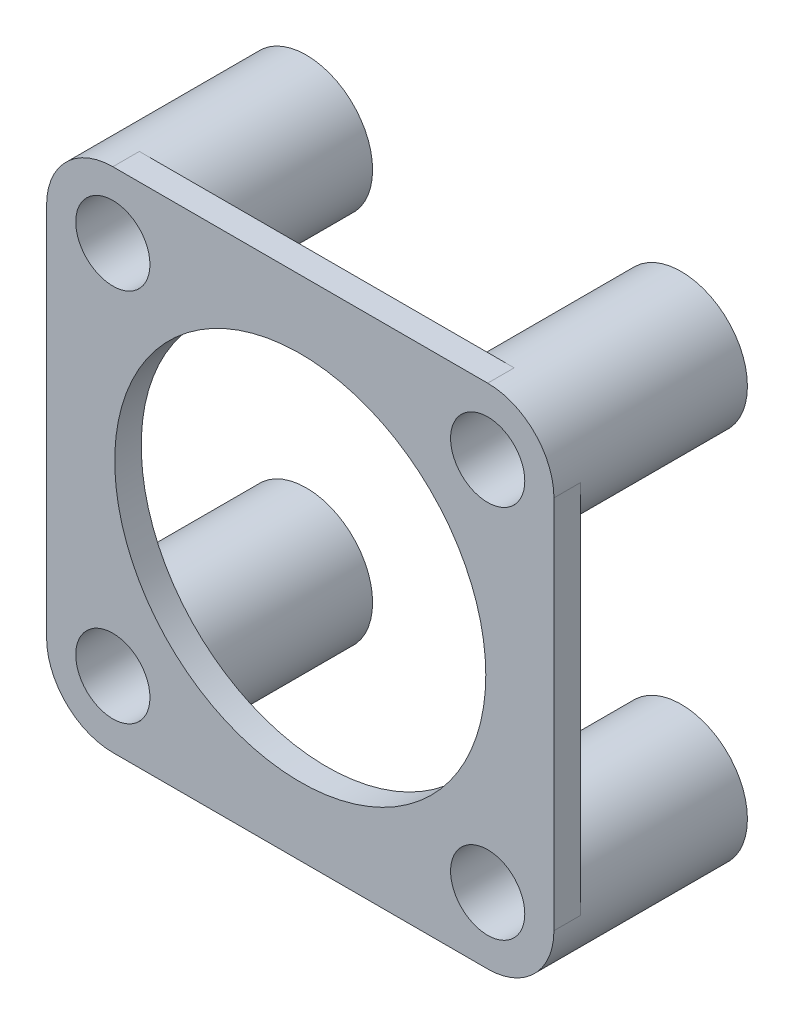
ISO-10303-21;
HEADER;
FILE_DESCRIPTION(('STEP AP214'),'2;1');
FILE_NAME('part.step','',(''),(''),'','','');
FILE_SCHEMA(('AUTOMOTIVE_DESIGN { 1 0 10303 214 1 1 1 1 }'));
ENDSEC;
DATA;
#1=APPLICATION_CONTEXT('core data for automotive mechanical design processes');
#2=APPLICATION_PROTOCOL_DEFINITION('international standard','automotive_design',2000,#1);
#3=PRODUCT_CONTEXT('',#1,'mechanical');
#4=PRODUCT('Part','Part','',(#3));
#5=PRODUCT_RELATED_PRODUCT_CATEGORY('part','',(#4));
#6=PRODUCT_DEFINITION_FORMATION('','',#4);
#7=PRODUCT_DEFINITION_CONTEXT('part definition',#1,'design');
#8=PRODUCT_DEFINITION('design','',#6,#7);
#9=PRODUCT_DEFINITION_SHAPE('','',#8);
#10=(LENGTH_UNIT() NAMED_UNIT(*) SI_UNIT(.MILLI.,.METRE.));
#11=(NAMED_UNIT(*) PLANE_ANGLE_UNIT() SI_UNIT($,.RADIAN.));
#12=(NAMED_UNIT(*) SI_UNIT($,.STERADIAN.) SOLID_ANGLE_UNIT());
#13=UNCERTAINTY_MEASURE_WITH_UNIT(LENGTH_MEASURE(1.E-05),#10,'distance_accuracy_value','');
#14=(GEOMETRIC_REPRESENTATION_CONTEXT(3) GLOBAL_UNCERTAINTY_ASSIGNED_CONTEXT((#13)) GLOBAL_UNIT_ASSIGNED_CONTEXT((#10,
#11,#12)) REPRESENTATION_CONTEXT('',''));
#15=CARTESIAN_POINT('',(0.,0.,0.));
#16=DIRECTION('',(0.,0.,1.));
#17=DIRECTION('',(1.,0.,0.));
#18=AXIS2_PLACEMENT_3D('',#15,#16,#17);
#19=CARTESIAN_POINT('',(-7.07106781186548,7.07106781186548,6.3));
#20=DIRECTION('',(0.,0.,1.));
#21=DIRECTION('',(1.,0.,0.));
#22=AXIS2_PLACEMENT_3D('',#19,#20,#21);
#23=PLANE('',#22);
#24=CARTESIAN_POINT('',(0.,0.,6.3));
#25=DIRECTION('',(0.,0.,1.));
#26=DIRECTION('',(1.,0.,0.));
#27=AXIS2_PLACEMENT_3D('',#24,#25,#26);
#28=CIRCLE('',#27,7.);
#29=CARTESIAN_POINT('',(7.,0.,6.3));
#30=VERTEX_POINT('',#29);
#31=EDGE_CURVE('E270',#30,#30,#28,.T.);
#32=ORIENTED_EDGE('',*,*,#31,.T.);
#33=EDGE_LOOP('',(#32));
#34=FACE_BOUND('',#33,.T.);
#35=CARTESIAN_POINT('',(-7.07106781186548,-7.07106781186547,6.3));
#36=DIRECTION('',(0.,0.,1.));
#37=DIRECTION('',(1.,0.,0.));
#38=AXIS2_PLACEMENT_3D('',#35,#36,#37);
#39=CIRCLE('',#38,2.5);
#40=CARTESIAN_POINT('',(-7.07106781186548,-9.57106781186547,6.3));
#41=VERTEX_POINT('',#40);
#42=CARTESIAN_POINT('',(-9.57106781186548,-7.07106781186547,6.3));
#43=VERTEX_POINT('',#42);
#44=EDGE_CURVE('E252',#41,#43,#39,.T.);
#45=ORIENTED_EDGE('',*,*,#44,.T.);
#46=DIRECTION('',(0.,-1.,0.));
#47=VECTOR('',#46,1.);
#48=CARTESIAN_POINT('',(-9.57106781186548,7.07106781186548,6.3));
#49=LINE('',#48,#47);
#50=CARTESIAN_POINT('',(-9.57106781186548,7.07106781186548,6.3));
#51=VERTEX_POINT('',#50);
#52=EDGE_CURVE('E138',#51,#43,#49,.T.);
#53=ORIENTED_EDGE('',*,*,#52,.F.);
#54=CARTESIAN_POINT('',(-7.07106781186548,7.07106781186548,6.3));
#55=DIRECTION('',(0.,0.,1.));
#56=DIRECTION('',(1.,0.,0.));
#57=AXIS2_PLACEMENT_3D('',#54,#55,#56);
#58=CIRCLE('',#57,2.5);
#59=CARTESIAN_POINT('',(-7.07106781186548,9.57106781186548,6.3));
#60=VERTEX_POINT('',#59);
#61=EDGE_CURVE('E11',#51,#60,#58,.T.);
#62=ORIENTED_EDGE('',*,*,#61,.T.);
#63=DIRECTION('',(-1.,0.,0.));
#64=VECTOR('',#63,1.);
#65=CARTESIAN_POINT('',(7.07106781186548,9.57106781186548,6.3));
#66=LINE('',#65,#64);
#67=CARTESIAN_POINT('',(7.07106781186548,9.57106781186548,6.3));
#68=VERTEX_POINT('',#67);
#69=EDGE_CURVE('E146',#68,#60,#66,.T.);
#70=ORIENTED_EDGE('',*,*,#69,.F.);
#71=CARTESIAN_POINT('',(7.07106781186548,7.07106781186548,6.3));
#72=DIRECTION('',(0.,0.,1.));
#73=DIRECTION('',(1.,0.,0.));
#74=AXIS2_PLACEMENT_3D('',#71,#72,#73);
#75=CIRCLE('',#74,2.5);
#76=CARTESIAN_POINT('',(9.57106781186548,7.07106781186548,6.3));
#77=VERTEX_POINT('',#76);
#78=EDGE_CURVE('E261',#68,#77,#75,.T.);
#79=ORIENTED_EDGE('',*,*,#78,.T.);
#80=DIRECTION('',(0.,1.,0.));
#81=VECTOR('',#80,1.);
#82=CARTESIAN_POINT('',(9.57106781186548,-7.07106781186547,6.3));
#83=LINE('',#82,#81);
#84=CARTESIAN_POINT('',(9.57106781186548,-7.07106781186547,6.3));
#85=VERTEX_POINT('',#84);
#86=EDGE_CURVE('E125',#85,#77,#83,.T.);
#87=ORIENTED_EDGE('',*,*,#86,.F.);
#88=CARTESIAN_POINT('',(7.07106781186548,-7.07106781186547,6.3));
#89=DIRECTION('',(0.,0.,1.));
#90=DIRECTION('',(1.,0.,0.));
#91=AXIS2_PLACEMENT_3D('',#88,#89,#90);
#92=CIRCLE('',#91,2.5);
#93=CARTESIAN_POINT('',(7.07106781186548,-9.57106781186547,6.3));
#94=VERTEX_POINT('',#93);
#95=EDGE_CURVE('E247',#85,#94,#92,.T.);
#96=ORIENTED_EDGE('',*,*,#95,.T.);
#97=DIRECTION('',(1.,0.,0.));
#98=VECTOR('',#97,1.);
#99=CARTESIAN_POINT('',(-7.07106781186548,-9.57106781186547,6.3));
#100=LINE('',#99,#98);
#101=EDGE_CURVE('E141',#41,#94,#100,.T.);
#102=ORIENTED_EDGE('',*,*,#101,.F.);
#103=EDGE_LOOP('',(#45,#53,#62,#70,#79,#87,#96,#102));
#104=FACE_BOUND('',#103,.T.);
#105=ADVANCED_FACE('F43',(#34,#104),#23,.F.);
#106=CARTESIAN_POINT('',(-7.07106781186548,7.07106781186548,0.));
#107=DIRECTION('',(0.,0.,1.));
#108=DIRECTION('',(1.,0.,0.));
#109=AXIS2_PLACEMENT_3D('',#106,#107,#108);
#110=PLANE('',#109);
#111=CARTESIAN_POINT('',(-7.07106781186548,7.07106781186548,0.));
#112=DIRECTION('',(0.,0.,1.));
#113=DIRECTION('',(1.,0.,0.));
#114=AXIS2_PLACEMENT_3D('',#111,#112,#113);
#115=CIRCLE('',#114,2.5);
#116=CARTESIAN_POINT('',(-4.57106781186547,7.07106781186548,0.));
#117=VERTEX_POINT('',#116);
#118=EDGE_CURVE('E47',#117,#117,#115,.T.);
#119=ORIENTED_EDGE('',*,*,#118,.F.);
#120=EDGE_LOOP('',(#119));
#121=FACE_BOUND('',#120,.T.);
#122=CARTESIAN_POINT('',(-7.07106781186548,7.07106781186548,0.));
#123=DIRECTION('',(0.,0.,1.));
#124=DIRECTION('',(1.,0.,0.));
#125=AXIS2_PLACEMENT_3D('',#122,#123,#124);
#126=CIRCLE('',#125,1.4);
#127=CARTESIAN_POINT('',(-5.67106781186548,7.07106781186548,0.));
#128=VERTEX_POINT('',#127);
#129=EDGE_CURVE('E163',#128,#128,#126,.T.);
#130=ORIENTED_EDGE('',*,*,#129,.T.);
#131=EDGE_LOOP('',(#130));
#132=FACE_BOUND('',#131,.T.);
#133=ADVANCED_FACE('F171',(#121,#132),#110,.F.);
#134=CARTESIAN_POINT('',(-7.07106781186548,7.07106781186548,6.3));
#135=DIRECTION('',(0.,0.,-1.));
#136=DIRECTION('',(-1.,0.,0.));
#137=AXIS2_PLACEMENT_3D('',#134,#135,#136);
#138=CYLINDRICAL_SURFACE('',#137,2.5);
#139=ORIENTED_EDGE('',*,*,#61,.F.);
#140=DIRECTION('',(0.,0.,-1.));
#141=VECTOR('',#140,1.);
#142=CARTESIAN_POINT('',(-9.57106781186548,7.07106781186548,7.3));
#143=LINE('',#142,#141);
#144=CARTESIAN_POINT('',(-9.57106781186548,7.07106781186548,7.3));
#145=VERTEX_POINT('',#144);
#146=EDGE_CURVE('E161',#145,#51,#143,.T.);
#147=ORIENTED_EDGE('',*,*,#146,.F.);
#148=CARTESIAN_POINT('',(-7.07106781186548,7.07106781186548,7.3));
#149=DIRECTION('',(0.,0.,1.));
#150=DIRECTION('',(1.,0.,0.));
#151=AXIS2_PLACEMENT_3D('',#148,#149,#150);
#152=CIRCLE('',#151,2.5);
#153=CARTESIAN_POINT('',(-7.07106781186548,9.57106781186548,7.3));
#154=VERTEX_POINT('',#153);
#155=EDGE_CURVE('E148',#154,#145,#152,.T.);
#156=ORIENTED_EDGE('',*,*,#155,.F.);
#157=DIRECTION('',(0.,0.,-1.));
#158=VECTOR('',#157,1.);
#159=CARTESIAN_POINT('',(-7.07106781186548,9.57106781186548,7.3));
#160=LINE('',#159,#158);
#161=EDGE_CURVE('E134',#154,#60,#160,.T.);
#162=ORIENTED_EDGE('',*,*,#161,.T.);
#163=EDGE_LOOP('',(#139,#147,#156,#162));
#164=FACE_BOUND('',#163,.T.);
#165=ORIENTED_EDGE('',*,*,#118,.T.);
#166=EDGE_LOOP('',(#165));
#167=FACE_BOUND('',#166,.T.);
#168=ADVANCED_FACE('F45',(#164,#167),#138,.T.);
#169=CARTESIAN_POINT('',(-7.07106781186548,7.07106781186548,6.3));
#170=DIRECTION('',(0.,0.,-1.));
#171=DIRECTION('',(-1.,0.,0.));
#172=AXIS2_PLACEMENT_3D('',#169,#170,#171);
#173=CYLINDRICAL_SURFACE('',#172,1.4);
#174=ORIENTED_EDGE('',*,*,#129,.F.);
#175=EDGE_LOOP('',(#174));
#176=FACE_BOUND('',#175,.T.);
#177=CARTESIAN_POINT('',(-7.07106781186548,7.07106781186548,7.3));
#178=DIRECTION('',(0.,0.,1.));
#179=DIRECTION('',(1.,0.,0.));
#180=AXIS2_PLACEMENT_3D('',#177,#178,#179);
#181=CIRCLE('',#180,1.4);
#182=CARTESIAN_POINT('',(-5.67106781186548,7.07106781186548,7.3));
#183=VERTEX_POINT('',#182);
#184=EDGE_CURVE('E274',#183,#183,#181,.T.);
#185=ORIENTED_EDGE('',*,*,#184,.T.);
#186=EDGE_LOOP('',(#185));
#187=FACE_BOUND('',#186,.T.);
#188=ADVANCED_FACE('F177',(#176,#187),#173,.F.);
#189=CARTESIAN_POINT('',(-7.07106781186548,7.07106781186548,7.3));
#190=DIRECTION('',(0.,0.,1.));
#191=DIRECTION('',(1.,0.,0.));
#192=AXIS2_PLACEMENT_3D('',#189,#190,#191);
#193=PLANE('',#192);
#194=ORIENTED_EDGE('',*,*,#184,.F.);
#195=EDGE_LOOP('',(#194));
#196=FACE_BOUND('',#195,.T.);
#197=CARTESIAN_POINT('',(7.07106781186548,7.07106781186548,7.3));
#198=DIRECTION('',(0.,0.,1.));
#199=DIRECTION('',(1.,0.,0.));
#200=AXIS2_PLACEMENT_3D('',#197,#198,#199);
#201=CIRCLE('',#200,1.4);
#202=CARTESIAN_POINT('',(8.47106781186548,7.07106781186548,7.3));
#203=VERTEX_POINT('',#202);
#204=EDGE_CURVE('E282',#203,#203,#201,.T.);
#205=ORIENTED_EDGE('',*,*,#204,.F.);
#206=EDGE_LOOP('',(#205));
#207=FACE_BOUND('',#206,.T.);
#208=ORIENTED_EDGE('',*,*,#155,.T.);
#209=DIRECTION('',(0.,-1.,0.));
#210=VECTOR('',#209,1.);
#211=CARTESIAN_POINT('',(-9.57106781186548,7.07106781186548,7.3));
#212=LINE('',#211,#210);
#213=CARTESIAN_POINT('',(-9.57106781186548,-7.07106781186547,7.3));
#214=VERTEX_POINT('',#213);
#215=EDGE_CURVE('E92',#145,#214,#212,.T.);
#216=ORIENTED_EDGE('',*,*,#215,.T.);
#217=CARTESIAN_POINT('',(-7.07106781186548,-7.07106781186547,7.3));
#218=DIRECTION('',(0.,0.,1.));
#219=DIRECTION('',(1.,0.,0.));
#220=AXIS2_PLACEMENT_3D('',#217,#218,#219);
#221=CIRCLE('',#220,2.5);
#222=CARTESIAN_POINT('',(-7.07106781186548,-9.57106781186547,7.3));
#223=VERTEX_POINT('',#222);
#224=EDGE_CURVE('E289',#214,#223,#221,.T.);
#225=ORIENTED_EDGE('',*,*,#224,.T.);
#226=DIRECTION('',(1.,0.,0.));
#227=VECTOR('',#226,1.);
#228=CARTESIAN_POINT('',(-7.07106781186548,-9.57106781186547,7.3));
#229=LINE('',#228,#227);
#230=CARTESIAN_POINT('',(7.07106781186548,-9.57106781186547,7.3));
#231=VERTEX_POINT('',#230);
#232=EDGE_CURVE('E291',#223,#231,#229,.T.);
#233=ORIENTED_EDGE('',*,*,#232,.T.);
#234=CARTESIAN_POINT('',(7.07106781186548,-7.07106781186547,7.3));
#235=DIRECTION('',(0.,0.,1.));
#236=DIRECTION('',(1.,0.,0.));
#237=AXIS2_PLACEMENT_3D('',#234,#235,#236);
#238=CIRCLE('',#237,2.5);
#239=CARTESIAN_POINT('',(9.57106781186548,-7.07106781186547,7.3));
#240=VERTEX_POINT('',#239);
#241=EDGE_CURVE('E115',#231,#240,#238,.T.);
#242=ORIENTED_EDGE('',*,*,#241,.T.);
#243=DIRECTION('',(0.,1.,0.));
#244=VECTOR('',#243,1.);
#245=CARTESIAN_POINT('',(9.57106781186548,-7.07106781186547,7.3));
#246=LINE('',#245,#244);
#247=CARTESIAN_POINT('',(9.57106781186548,7.07106781186548,7.3));
#248=VERTEX_POINT('',#247);
#249=EDGE_CURVE('E107',#240,#248,#246,.T.);
#250=ORIENTED_EDGE('',*,*,#249,.T.);
#251=CARTESIAN_POINT('',(7.07106781186548,7.07106781186548,7.3));
#252=DIRECTION('',(0.,0.,1.));
#253=DIRECTION('',(1.,0.,0.));
#254=AXIS2_PLACEMENT_3D('',#251,#252,#253);
#255=CIRCLE('',#254,2.5);
#256=CARTESIAN_POINT('',(7.07106781186548,9.57106781186548,7.3));
#257=VERTEX_POINT('',#256);
#258=EDGE_CURVE('E112',#248,#257,#255,.T.);
#259=ORIENTED_EDGE('',*,*,#258,.T.);
#260=DIRECTION('',(-1.,0.,0.));
#261=VECTOR('',#260,1.);
#262=CARTESIAN_POINT('',(7.07106781186548,9.57106781186548,7.3));
#263=LINE('',#262,#261);
#264=EDGE_CURVE('E65',#257,#154,#263,.T.);
#265=ORIENTED_EDGE('',*,*,#264,.T.);
#266=EDGE_LOOP('',(#208,#216,#225,#233,#242,#250,#259,#265));
#267=FACE_BOUND('',#266,.T.);
#268=CARTESIAN_POINT('',(7.07106781186548,-7.07106781186547,7.3));
#269=DIRECTION('',(0.,0.,1.));
#270=DIRECTION('',(1.,0.,0.));
#271=AXIS2_PLACEMENT_3D('',#268,#269,#270);
#272=CIRCLE('',#271,1.4);
#273=CARTESIAN_POINT('',(8.47106781186548,-7.07106781186547,7.3));
#274=VERTEX_POINT('',#273);
#275=EDGE_CURVE('E142',#274,#274,#272,.T.);
#276=ORIENTED_EDGE('',*,*,#275,.F.);
#277=EDGE_LOOP('',(#276));
#278=FACE_BOUND('',#277,.T.);
#279=CARTESIAN_POINT('',(-7.07106781186548,-7.07106781186547,7.3));
#280=DIRECTION('',(0.,0.,1.));
#281=DIRECTION('',(1.,0.,0.));
#282=AXIS2_PLACEMENT_3D('',#279,#280,#281);
#283=CIRCLE('',#282,1.4);
#284=CARTESIAN_POINT('',(-5.67106781186548,-7.07106781186547,7.3));
#285=VERTEX_POINT('',#284);
#286=EDGE_CURVE('E279',#285,#285,#283,.T.);
#287=ORIENTED_EDGE('',*,*,#286,.F.);
#288=EDGE_LOOP('',(#287));
#289=FACE_BOUND('',#288,.T.);
#290=CARTESIAN_POINT('',(0.,0.,7.3));
#291=DIRECTION('',(0.,0.,1.));
#292=DIRECTION('',(1.,0.,0.));
#293=AXIS2_PLACEMENT_3D('',#290,#291,#292);
#294=CIRCLE('',#293,7.);
#295=CARTESIAN_POINT('',(7.,0.,7.3));
#296=VERTEX_POINT('',#295);
#297=EDGE_CURVE('E271',#296,#296,#294,.T.);
#298=ORIENTED_EDGE('',*,*,#297,.F.);
#299=EDGE_LOOP('',(#298));
#300=FACE_BOUND('',#299,.T.);
#301=ADVANCED_FACE('F109',(#196,#207,#267,#278,#289,#300),#193,.T.);
#302=CARTESIAN_POINT('',(-9.57106781186548,7.07106781186548,7.3));
#303=DIRECTION('',(1.,0.,0.));
#304=DIRECTION('',(0.,0.,-1.));
#305=AXIS2_PLACEMENT_3D('',#302,#303,#304);
#306=PLANE('',#305);
#307=ORIENTED_EDGE('',*,*,#52,.T.);
#308=DIRECTION('',(0.,0.,-1.));
#309=VECTOR('',#308,1.);
#310=CARTESIAN_POINT('',(-9.57106781186548,-7.07106781186547,7.3));
#311=LINE('',#310,#309);
#312=EDGE_CURVE('E158',#214,#43,#311,.T.);
#313=ORIENTED_EDGE('',*,*,#312,.F.);
#314=ORIENTED_EDGE('',*,*,#215,.F.);
#315=ORIENTED_EDGE('',*,*,#146,.T.);
#316=EDGE_LOOP('',(#307,#313,#314,#315));
#317=FACE_BOUND('',#316,.T.);
#318=ADVANCED_FACE('F184',(#317),#306,.F.);
#319=CARTESIAN_POINT('',(-7.07106781186548,-7.07106781186547,7.3));
#320=DIRECTION('',(0.,0.,-1.));
#321=DIRECTION('',(-1.,0.,0.));
#322=AXIS2_PLACEMENT_3D('',#319,#320,#321);
#323=CYLINDRICAL_SURFACE('',#322,2.5);
#324=ORIENTED_EDGE('',*,*,#312,.T.);
#325=ORIENTED_EDGE('',*,*,#44,.F.);
#326=DIRECTION('',(0.,0.,-1.));
#327=VECTOR('',#326,1.);
#328=CARTESIAN_POINT('',(-7.07106781186548,-9.57106781186547,7.3));
#329=LINE('',#328,#327);
#330=EDGE_CURVE('E155',#223,#41,#329,.T.);
#331=ORIENTED_EDGE('',*,*,#330,.F.);
#332=ORIENTED_EDGE('',*,*,#224,.F.);
#333=EDGE_LOOP('',(#324,#325,#331,#332));
#334=FACE_BOUND('',#333,.T.);
#335=CARTESIAN_POINT('',(-7.07106781186548,-7.07106781186547,0.));
#336=DIRECTION('',(0.,0.,1.));
#337=DIRECTION('',(1.,0.,0.));
#338=AXIS2_PLACEMENT_3D('',#335,#336,#337);
#339=CIRCLE('',#338,2.5);
#340=CARTESIAN_POINT('',(-4.57106781186547,-7.07106781186547,0.));
#341=VERTEX_POINT('',#340);
#342=EDGE_CURVE('E242',#341,#341,#339,.T.);
#343=ORIENTED_EDGE('',*,*,#342,.T.);
#344=EDGE_LOOP('',(#343));
#345=FACE_BOUND('',#344,.T.);
#346=ADVANCED_FACE('F187',(#334,#345),#323,.T.);
#347=CARTESIAN_POINT('',(-7.07106781186548,-9.57106781186547,7.3));
#348=DIRECTION('',(0.,1.,0.));
#349=DIRECTION('',(0.,0.,1.));
#350=AXIS2_PLACEMENT_3D('',#347,#348,#349);
#351=PLANE('',#350);
#352=ORIENTED_EDGE('',*,*,#101,.T.);
#353=DIRECTION('',(0.,0.,-1.));
#354=VECTOR('',#353,1.);
#355=CARTESIAN_POINT('',(7.07106781186548,-9.57106781186547,7.3));
#356=LINE('',#355,#354);
#357=EDGE_CURVE('E152',#231,#94,#356,.T.);
#358=ORIENTED_EDGE('',*,*,#357,.F.);
#359=ORIENTED_EDGE('',*,*,#232,.F.);
#360=ORIENTED_EDGE('',*,*,#330,.T.);
#361=EDGE_LOOP('',(#352,#358,#359,#360));
#362=FACE_BOUND('',#361,.T.);
#363=ADVANCED_FACE('F190',(#362),#351,.F.);
#364=CARTESIAN_POINT('',(7.07106781186548,-7.07106781186547,7.3));
#365=DIRECTION('',(0.,0.,-1.));
#366=DIRECTION('',(-1.,0.,0.));
#367=AXIS2_PLACEMENT_3D('',#364,#365,#366);
#368=CYLINDRICAL_SURFACE('',#367,2.5);
#369=ORIENTED_EDGE('',*,*,#357,.T.);
#370=ORIENTED_EDGE('',*,*,#95,.F.);
#371=DIRECTION('',(0.,0.,-1.));
#372=VECTOR('',#371,1.);
#373=CARTESIAN_POINT('',(9.57106781186548,-7.07106781186547,7.3));
#374=LINE('',#373,#372);
#375=EDGE_CURVE('E127',#240,#85,#374,.T.);
#376=ORIENTED_EDGE('',*,*,#375,.F.);
#377=ORIENTED_EDGE('',*,*,#241,.F.);
#378=EDGE_LOOP('',(#369,#370,#376,#377));
#379=FACE_BOUND('',#378,.T.);
#380=CARTESIAN_POINT('',(7.07106781186548,-7.07106781186547,0.));
#381=DIRECTION('',(0.,0.,1.));
#382=DIRECTION('',(1.,0.,0.));
#383=AXIS2_PLACEMENT_3D('',#380,#381,#382);
#384=CIRCLE('',#383,2.5);
#385=CARTESIAN_POINT('',(9.57106781186548,-7.07106781186547,0.));
#386=VERTEX_POINT('',#385);
#387=EDGE_CURVE('E250',#386,#386,#384,.T.);
#388=ORIENTED_EDGE('',*,*,#387,.T.);
#389=EDGE_LOOP('',(#388));
#390=FACE_BOUND('',#389,.T.);
#391=ADVANCED_FACE('F194',(#379,#390),#368,.T.);
#392=CARTESIAN_POINT('',(9.57106781186548,-7.07106781186547,7.3));
#393=DIRECTION('',(-1.,0.,0.));
#394=DIRECTION('',(0.,0.,1.));
#395=AXIS2_PLACEMENT_3D('',#392,#393,#394);
#396=PLANE('',#395);
#397=ORIENTED_EDGE('',*,*,#86,.T.);
#398=DIRECTION('',(0.,0.,-1.));
#399=VECTOR('',#398,1.);
#400=CARTESIAN_POINT('',(9.57106781186548,7.07106781186548,7.3));
#401=LINE('',#400,#399);
#402=EDGE_CURVE('E122',#248,#77,#401,.T.);
#403=ORIENTED_EDGE('',*,*,#402,.F.);
#404=ORIENTED_EDGE('',*,*,#249,.F.);
#405=ORIENTED_EDGE('',*,*,#375,.T.);
#406=EDGE_LOOP('',(#397,#403,#404,#405));
#407=FACE_BOUND('',#406,.T.);
#408=ADVANCED_FACE('F123',(#407),#396,.F.);
#409=CARTESIAN_POINT('',(7.07106781186548,7.07106781186548,7.3));
#410=DIRECTION('',(0.,0.,-1.));
#411=DIRECTION('',(-1.,0.,0.));
#412=AXIS2_PLACEMENT_3D('',#409,#410,#411);
#413=CYLINDRICAL_SURFACE('',#412,2.5);
#414=ORIENTED_EDGE('',*,*,#402,.T.);
#415=ORIENTED_EDGE('',*,*,#78,.F.);
#416=DIRECTION('',(0.,0.,-1.));
#417=VECTOR('',#416,1.);
#418=CARTESIAN_POINT('',(7.07106781186548,9.57106781186548,7.3));
#419=LINE('',#418,#417);
#420=EDGE_CURVE('E128',#257,#68,#419,.T.);
#421=ORIENTED_EDGE('',*,*,#420,.F.);
#422=ORIENTED_EDGE('',*,*,#258,.F.);
#423=EDGE_LOOP('',(#414,#415,#421,#422));
#424=FACE_BOUND('',#423,.T.);
#425=CARTESIAN_POINT('',(7.07106781186548,7.07106781186548,0.));
#426=DIRECTION('',(0.,0.,1.));
#427=DIRECTION('',(1.,0.,0.));
#428=AXIS2_PLACEMENT_3D('',#425,#426,#427);
#429=CIRCLE('',#428,2.5);
#430=CARTESIAN_POINT('',(9.57106781186548,7.07106781186548,0.));
#431=VERTEX_POINT('',#430);
#432=EDGE_CURVE('E262',#431,#431,#429,.T.);
#433=ORIENTED_EDGE('',*,*,#432,.T.);
#434=EDGE_LOOP('',(#433));
#435=FACE_BOUND('',#434,.T.);
#436=ADVANCED_FACE('F130',(#424,#435),#413,.T.);
#437=CARTESIAN_POINT('',(7.07106781186548,9.57106781186548,7.3));
#438=DIRECTION('',(0.,-1.,0.));
#439=DIRECTION('',(0.,0.,-1.));
#440=AXIS2_PLACEMENT_3D('',#437,#438,#439);
#441=PLANE('',#440);
#442=ORIENTED_EDGE('',*,*,#69,.T.);
#443=ORIENTED_EDGE('',*,*,#161,.F.);
#444=ORIENTED_EDGE('',*,*,#264,.F.);
#445=ORIENTED_EDGE('',*,*,#420,.T.);
#446=EDGE_LOOP('',(#442,#443,#444,#445));
#447=FACE_BOUND('',#446,.T.);
#448=ADVANCED_FACE('F203',(#447),#441,.F.);
#449=CARTESIAN_POINT('',(7.07106781186548,-7.07106781186547,7.3));
#450=DIRECTION('',(0.,0.,-1.));
#451=DIRECTION('',(-1.,0.,0.));
#452=AXIS2_PLACEMENT_3D('',#449,#450,#451);
#453=CYLINDRICAL_SURFACE('',#452,1.4);
#454=ORIENTED_EDGE('',*,*,#275,.T.);
#455=EDGE_LOOP('',(#454));
#456=FACE_BOUND('',#455,.T.);
#457=CARTESIAN_POINT('',(7.07106781186548,-7.07106781186547,0.));
#458=DIRECTION('',(0.,0.,1.));
#459=DIRECTION('',(1.,0.,0.));
#460=AXIS2_PLACEMENT_3D('',#457,#458,#459);
#461=CIRCLE('',#460,1.4);
#462=CARTESIAN_POINT('',(8.47106781186548,-7.07106781186547,0.));
#463=VERTEX_POINT('',#462);
#464=EDGE_CURVE('E257',#463,#463,#461,.T.);
#465=ORIENTED_EDGE('',*,*,#464,.F.);
#466=EDGE_LOOP('',(#465));
#467=FACE_BOUND('',#466,.T.);
#468=ADVANCED_FACE('F205',(#456,#467),#453,.F.);
#469=CARTESIAN_POINT('',(7.07106781186548,7.07106781186548,7.3));
#470=DIRECTION('',(0.,0.,-1.));
#471=DIRECTION('',(-1.,0.,0.));
#472=AXIS2_PLACEMENT_3D('',#469,#470,#471);
#473=CYLINDRICAL_SURFACE('',#472,1.4);
#474=ORIENTED_EDGE('',*,*,#204,.T.);
#475=EDGE_LOOP('',(#474));
#476=FACE_BOUND('',#475,.T.);
#477=CARTESIAN_POINT('',(7.07106781186548,7.07106781186548,0.));
#478=DIRECTION('',(0.,0.,1.));
#479=DIRECTION('',(1.,0.,0.));
#480=AXIS2_PLACEMENT_3D('',#477,#478,#479);
#481=CIRCLE('',#480,1.4);
#482=CARTESIAN_POINT('',(8.47106781186548,7.07106781186548,0.));
#483=VERTEX_POINT('',#482);
#484=EDGE_CURVE('E265',#483,#483,#481,.T.);
#485=ORIENTED_EDGE('',*,*,#484,.F.);
#486=EDGE_LOOP('',(#485));
#487=FACE_BOUND('',#486,.T.);
#488=ADVANCED_FACE('F213',(#476,#487),#473,.F.);
#489=CARTESIAN_POINT('',(-7.07106781186548,-7.07106781186547,7.3));
#490=DIRECTION('',(0.,0.,-1.));
#491=DIRECTION('',(-1.,0.,0.));
#492=AXIS2_PLACEMENT_3D('',#489,#490,#491);
#493=CYLINDRICAL_SURFACE('',#492,1.4);
#494=ORIENTED_EDGE('',*,*,#286,.T.);
#495=EDGE_LOOP('',(#494));
#496=FACE_BOUND('',#495,.T.);
#497=CARTESIAN_POINT('',(-7.07106781186548,-7.07106781186547,0.));
#498=DIRECTION('',(0.,0.,1.));
#499=DIRECTION('',(1.,0.,0.));
#500=AXIS2_PLACEMENT_3D('',#497,#498,#499);
#501=CIRCLE('',#500,1.4);
#502=CARTESIAN_POINT('',(-5.67106781186548,-7.07106781186547,0.));
#503=VERTEX_POINT('',#502);
#504=EDGE_CURVE('E245',#503,#503,#501,.T.);
#505=ORIENTED_EDGE('',*,*,#504,.F.);
#506=EDGE_LOOP('',(#505));
#507=FACE_BOUND('',#506,.T.);
#508=ADVANCED_FACE('F217',(#496,#507),#493,.F.);
#509=CARTESIAN_POINT('',(0.,0.,7.3));
#510=DIRECTION('',(0.,0.,-1.));
#511=DIRECTION('',(-1.,0.,0.));
#512=AXIS2_PLACEMENT_3D('',#509,#510,#511);
#513=CYLINDRICAL_SURFACE('',#512,7.);
#514=ORIENTED_EDGE('',*,*,#297,.T.);
#515=EDGE_LOOP('',(#514));
#516=FACE_BOUND('',#515,.T.);
#517=ORIENTED_EDGE('',*,*,#31,.F.);
#518=EDGE_LOOP('',(#517));
#519=FACE_BOUND('',#518,.T.);
#520=ADVANCED_FACE('F221',(#516,#519),#513,.F.);
#521=CARTESIAN_POINT('',(7.07106781186548,7.07106781186548,0.));
#522=DIRECTION('',(0.,0.,1.));
#523=DIRECTION('',(1.,0.,0.));
#524=AXIS2_PLACEMENT_3D('',#521,#522,#523);
#525=PLANE('',#524);
#526=ORIENTED_EDGE('',*,*,#432,.F.);
#527=EDGE_LOOP('',(#526));
#528=FACE_BOUND('',#527,.T.);
#529=ORIENTED_EDGE('',*,*,#484,.T.);
#530=EDGE_LOOP('',(#529));
#531=FACE_BOUND('',#530,.T.);
#532=ADVANCED_FACE('F225',(#528,#531),#525,.F.);
#533=CARTESIAN_POINT('',(7.07106781186548,-7.07106781186547,0.));
#534=DIRECTION('',(0.,0.,1.));
#535=DIRECTION('',(1.,0.,0.));
#536=AXIS2_PLACEMENT_3D('',#533,#534,#535);
#537=PLANE('',#536);
#538=ORIENTED_EDGE('',*,*,#387,.F.);
#539=EDGE_LOOP('',(#538));
#540=FACE_BOUND('',#539,.T.);
#541=ORIENTED_EDGE('',*,*,#464,.T.);
#542=EDGE_LOOP('',(#541));
#543=FACE_BOUND('',#542,.T.);
#544=ADVANCED_FACE('F229',(#540,#543),#537,.F.);
#545=CARTESIAN_POINT('',(-7.07106781186548,-7.07106781186547,0.));
#546=DIRECTION('',(0.,0.,1.));
#547=DIRECTION('',(1.,0.,0.));
#548=AXIS2_PLACEMENT_3D('',#545,#546,#547);
#549=PLANE('',#548);
#550=ORIENTED_EDGE('',*,*,#342,.F.);
#551=EDGE_LOOP('',(#550));
#552=FACE_BOUND('',#551,.T.);
#553=ORIENTED_EDGE('',*,*,#504,.T.);
#554=EDGE_LOOP('',(#553));
#555=FACE_BOUND('',#554,.T.);
#556=ADVANCED_FACE('F233',(#552,#555),#549,.F.);
#557=CLOSED_SHELL('',(#105,#133,#168,#188,#301,#318,#346,#363,#391,#408,#436,#448,#468,#488,
#508,#520,#532,#544,#556));
#558=MANIFOLD_SOLID_BREP('B2',#557);
#559=ADVANCED_BREP_SHAPE_REPRESENTATION('',(#18,#558),#14);
#560=SHAPE_DEFINITION_REPRESENTATION(#9,#559);
ENDSEC;
END-ISO-10303-21;
